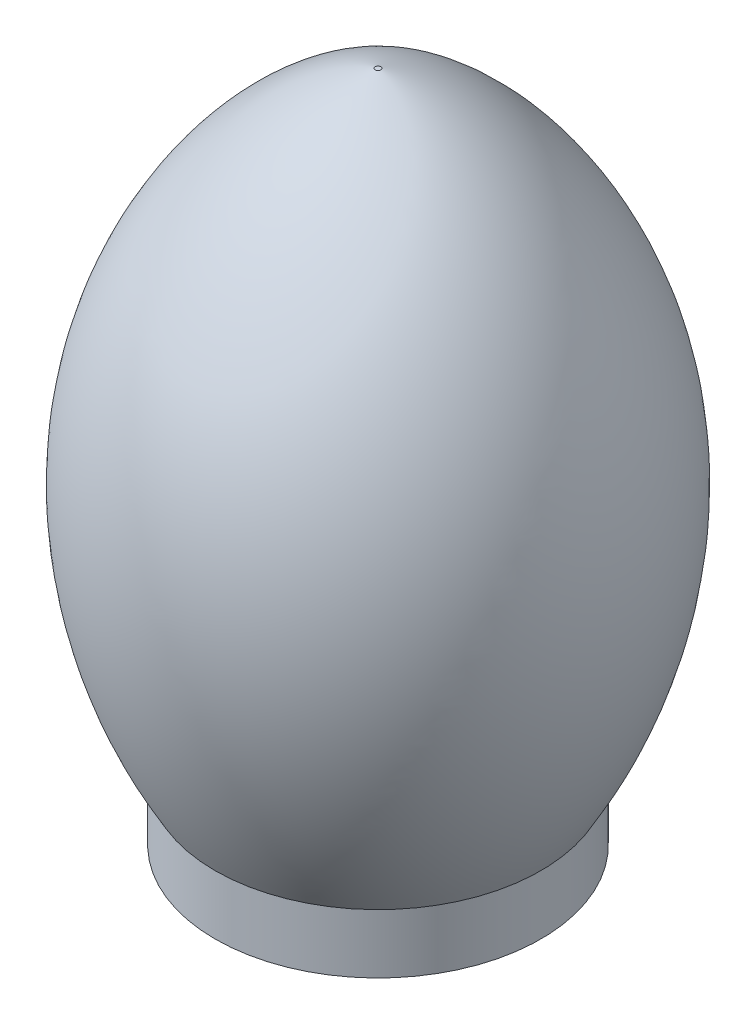
ISO-10303-21;
HEADER;
FILE_DESCRIPTION(('STEP AP214'),'2;1');
FILE_NAME('part.step','',(''),(''),'','','');
FILE_SCHEMA(('AUTOMOTIVE_DESIGN { 1 0 10303 214 1 1 1 1 }'));
ENDSEC;
DATA;
#1=APPLICATION_CONTEXT('core data for automotive mechanical design processes');
#2=APPLICATION_PROTOCOL_DEFINITION('international standard','automotive_design',2000,#1);
#3=PRODUCT_CONTEXT('',#1,'mechanical');
#4=PRODUCT('Part','Part','',(#3));
#5=PRODUCT_RELATED_PRODUCT_CATEGORY('part','',(#4));
#6=PRODUCT_DEFINITION_FORMATION('','',#4);
#7=PRODUCT_DEFINITION_CONTEXT('part definition',#1,'design');
#8=PRODUCT_DEFINITION('design','',#6,#7);
#9=PRODUCT_DEFINITION_SHAPE('','',#8);
#10=(LENGTH_UNIT() NAMED_UNIT(*) SI_UNIT(.MILLI.,.METRE.));
#11=(NAMED_UNIT(*) PLANE_ANGLE_UNIT() SI_UNIT($,.RADIAN.));
#12=(NAMED_UNIT(*) SI_UNIT($,.STERADIAN.) SOLID_ANGLE_UNIT());
#13=UNCERTAINTY_MEASURE_WITH_UNIT(LENGTH_MEASURE(1.E-05),#10,'distance_accuracy_value','');
#14=(GEOMETRIC_REPRESENTATION_CONTEXT(3) GLOBAL_UNCERTAINTY_ASSIGNED_CONTEXT((#13)) GLOBAL_UNIT_ASSIGNED_CONTEXT((#10,
#11,#12)) REPRESENTATION_CONTEXT('',''));
#15=CARTESIAN_POINT('',(0.,0.,0.));
#16=DIRECTION('',(0.,0.,1.));
#17=DIRECTION('',(1.,0.,0.));
#18=AXIS2_PLACEMENT_3D('',#15,#16,#17);
#19=CARTESIAN_POINT('',(0.,-156.440217310753,1.73358952312517));
#20=CARTESIAN_POINT('',(0.,-155.982540250555,1.99736031969315));
#21=CARTESIAN_POINT('',(0.,-155.075005504208,2.52166154879629));
#22=CARTESIAN_POINT('',(0.,-153.197381019125,3.59618691926529));
#23=CARTESIAN_POINT('',(0.,-149.898520111594,5.40853291107962));
#24=CARTESIAN_POINT('',(0.,-143.184195526544,8.8314438941949));
#25=CARTESIAN_POINT('',(0.,-133.320885589071,13.0915084510609));
#26=CARTESIAN_POINT('',(0.,-121.124330482223,17.1560298351578));
#27=CARTESIAN_POINT('',(0.,-104.498519625279,21.1044967516179));
#28=CARTESIAN_POINT('',(0.,-83.2463032424961,23.1522351838632));
#29=CARTESIAN_POINT('',(0.,-61.9420271551155,20.9857965337876));
#30=CARTESIAN_POINT('',(0.,-45.2360488326063,16.513939146641));
#31=CARTESIAN_POINT('',(0.,-28.8508969536115,10.1294094875408));
#32=CARTESIAN_POINT('',(0.,-13.3639018017232,0.917912268739273));
#33=CARTESIAN_POINT('',(0.,-0.0523508912760456,-10.8076029139682));
#34=CARTESIAN_POINT('',(0.,8.52414946827458,-20.7950562968071));
#35=CARTESIAN_POINT('',(0.,14.219192468324,-30.0608582533681));
#36=CARTESIAN_POINT('',(0.,17.7246072760641,-37.9888000394788));
#37=CARTESIAN_POINT('',(0.,19.1020344196853,-42.1349628048456));
#38=CARTESIAN_POINT('',(0.,19.6840745291793,-44.2319943927236));
#39=B_SPLINE_CURVE_WITH_KNOTS('',3,(#19,#20,#21,#22,#23,#24,#25,#26,#27,#28,#29,#30,#31,#32,#33,
#34,#35,#36,#37,#38),.UNSPECIFIED.,.F.,.F.,(4,1,1,1,1,1,1,1,1,1,1,1,1,1,1,1,1,4),
(-0.00861999079698822,-0.000740147118886745,0.00713969655921473,0.0228993839154177,
0.0544187586278235,0.117457508052635,0.180496257477447,0.243535006902259,0.369612505751882,
0.495690004601506,0.558728754026318,0.621767503451129,0.747845002300753,0.810883751725565,
0.873922501150377,0.936961250575188,0.968480625287594,1.),.UNSPECIFIED.);
#40=CARTESIAN_POINT('',(0.,16.7933542603554,-45.0343261990296));
#41=DIRECTION('',(0.,1.,0.));
#42=AXIS1_PLACEMENT('',#40,#41);
#43=SURFACE_OF_REVOLUTION('',#39,#42);
#44=CARTESIAN_POINT('',(0.,19.6840745291793,-45.0343261990296));
#45=DIRECTION('',(0.,1.,0.));
#46=DIRECTION('',(0.,0.,1.));
#47=AXIS2_PLACEMENT_3D('',#44,#45,#46);
#48=CIRCLE('',#47,0.802331806306046);
#49=CARTESIAN_POINT('',(0.,19.6840745291793,-44.2319943927236));
#50=VERTEX_POINT('',#49);
#51=EDGE_CURVE('E44',#50,#50,#48,.T.);
#52=ORIENTED_EDGE('',*,*,#51,.F.);
#53=EDGE_LOOP('',(#52));
#54=FACE_BOUND('',#53,.T.);
#55=CARTESIAN_POINT('',(0.,-156.440217310753,-45.0343261990296));
#56=DIRECTION('',(0.,-1.,0.));
#57=DIRECTION('',(0.,0.,-1.));
#58=AXIS2_PLACEMENT_3D('',#55,#56,#57);
#59=CIRCLE('',#58,46.7679157221548);
#60=CARTESIAN_POINT('',(0.,-156.440217310753,-91.8022419211844));
#61=VERTEX_POINT('',#60);
#62=EDGE_CURVE('E78',#61,#61,#59,.T.);
#63=ORIENTED_EDGE('',*,*,#62,.F.);
#64=EDGE_LOOP('',(#63));
#65=FACE_BOUND('',#64,.T.);
#66=ADVANCED_FACE('F36',(#54,#65),#43,.T.);
#67=CARTESIAN_POINT('',(0.,19.6840745291793,0.));
#68=DIRECTION('',(0.,1.,0.));
#69=DIRECTION('',(0.,0.,1.));
#70=AXIS2_PLACEMENT_3D('',#67,#68,#69);
#71=PLANE('',#70);
#72=ORIENTED_EDGE('',*,*,#51,.T.);
#73=EDGE_LOOP('',(#72));
#74=FACE_BOUND('',#73,.T.);
#75=ADVANCED_FACE('F61',(#74),#71,.T.);
#76=CARTESIAN_POINT('',(0.,-173.440217310753,-45.0343261990296));
#77=DIRECTION('',(0.,1.,0.));
#78=DIRECTION('',(0.,0.,1.));
#79=AXIS2_PLACEMENT_3D('',#76,#77,#78);
#80=CYLINDRICAL_SURFACE('',#79,46.7679157221548);
#81=CARTESIAN_POINT('',(0.,-173.440217310753,-45.0343261990296));
#82=DIRECTION('',(0.,-1.,0.));
#83=DIRECTION('',(0.,0.,-1.));
#84=AXIS2_PLACEMENT_3D('',#81,#82,#83);
#85=CIRCLE('',#84,46.7679157221548);
#86=CARTESIAN_POINT('',(0.,-173.440217310753,-91.8022419211844));
#87=VERTEX_POINT('',#86);
#88=EDGE_CURVE('E74',#87,#87,#85,.T.);
#89=ORIENTED_EDGE('',*,*,#88,.F.);
#90=EDGE_LOOP('',(#89));
#91=FACE_BOUND('',#90,.T.);
#92=ORIENTED_EDGE('',*,*,#62,.T.);
#93=EDGE_LOOP('',(#92));
#94=FACE_BOUND('',#93,.T.);
#95=ADVANCED_FACE('F85',(#91,#94),#80,.T.);
#96=CARTESIAN_POINT('',(0.,-173.440217310753,-45.0343261990296));
#97=DIRECTION('',(0.,-1.,0.));
#98=DIRECTION('',(0.,0.,-1.));
#99=AXIS2_PLACEMENT_3D('',#96,#97,#98);
#100=PLANE('',#99);
#101=ORIENTED_EDGE('',*,*,#88,.T.);
#102=EDGE_LOOP('',(#101));
#103=FACE_BOUND('',#102,.T.);
#104=ADVANCED_FACE('F95',(#103),#100,.T.);
#105=CLOSED_SHELL('',(#66,#75,#95,#104));
#106=CARTESIAN_POINT('',(0.,-153.440217310753,0.));
#107=DIRECTION('',(0.,-1.,0.));
#108=DIRECTION('',(0.,0.,-1.));
#109=AXIS2_PLACEMENT_3D('',#106,#107,#108);
#110=PLANE('',#109);
#111=CARTESIAN_POINT('',(0.,-153.440217310753,-45.0343261990296));
#112=DIRECTION('',(0.,1.,0.));
#113=DIRECTION('',(0.,0.,1.));
#114=AXIS2_PLACEMENT_3D('',#111,#112,#113);
#115=CIRCLE('',#114,45.0343261990296);
#116=CARTESIAN_POINT('',(0.,-153.440217310753,0.));
#117=VERTEX_POINT('',#116);
#118=EDGE_CURVE('E11',#117,#117,#115,.T.);
#119=ORIENTED_EDGE('',*,*,#118,.T.);
#120=EDGE_LOOP('',(#119));
#121=FACE_BOUND('',#120,.T.);
#122=ADVANCED_FACE('F50',(#121),#110,.F.);
#123=CARTESIAN_POINT('',(0.,-153.440217310753,0.));
#124=CARTESIAN_POINT('',(0.,-119.065516598152,19.8110042588273));
#125=CARTESIAN_POINT('',(0.,-48.4643809876704,30.0289971577804));
#126=CARTESIAN_POINT('',(0.,9.57042121720031,-19.0108297053081));
#127=CARTESIAN_POINT('',(0.,16.7933542603554,-45.0343261990296));
#128=B_SPLINE_CURVE_WITH_KNOTS('',3,(#123,#124,#125,#126,#127),.UNSPECIFIED.,.F.,.F.,(4,1,4),
(0.,0.591830554014814,1.),.UNSPECIFIED.);
#129=CARTESIAN_POINT('',(0.,16.7933542603554,-45.0343261990296));
#130=DIRECTION('',(0.,1.,0.));
#131=AXIS1_PLACEMENT('',#129,#130);
#132=SURFACE_OF_REVOLUTION('',#128,#131);
#133=CARTESIAN_POINT('',(0.,16.7933542603554,-45.0343261990296));
#134=VERTEX_POINT('',#133);
#135=VERTEX_LOOP('',#134);
#136=FACE_BOUND('',#135,.T.);
#137=ORIENTED_EDGE('',*,*,#118,.F.);
#138=EDGE_LOOP('',(#137));
#139=FACE_BOUND('',#138,.T.);
#140=ADVANCED_FACE('F47',(#136,#139),#132,.F.);
#141=CLOSED_SHELL('',(#122,#140));
#142=ORIENTED_CLOSED_SHELL('',*,#141,.T.);
#143=BREP_WITH_VOIDS('B2',#105,(#142));
#144=ADVANCED_BREP_SHAPE_REPRESENTATION('',(#18,#143),#14);
#145=SHAPE_DEFINITION_REPRESENTATION(#9,#144);
ENDSEC;
END-ISO-10303-21;
